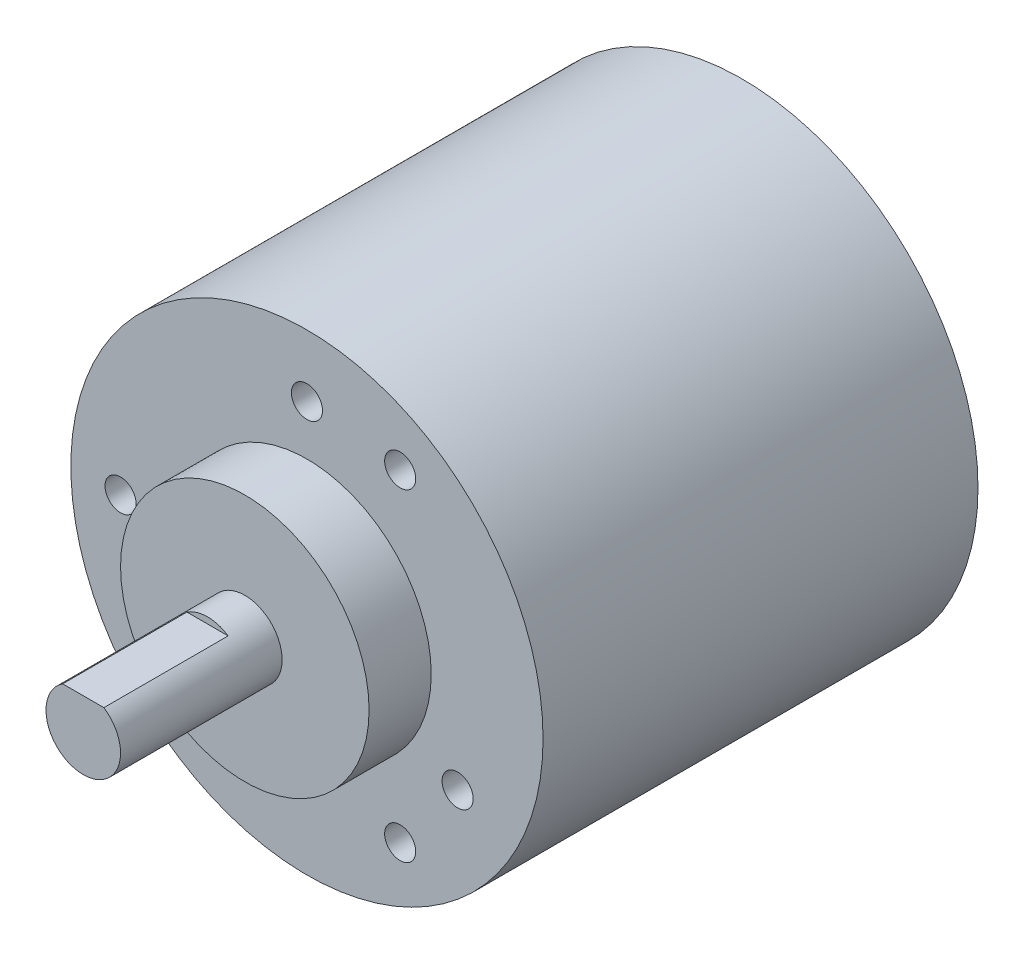
ISO-10303-21;
HEADER;
FILE_DESCRIPTION(('STEP AP214'),'2;1');
FILE_NAME('part.step','',(''),(''),'','','');
FILE_SCHEMA(('AUTOMOTIVE_DESIGN { 1 0 10303 214 1 1 1 1 }'));
ENDSEC;
DATA;
#1=APPLICATION_CONTEXT('core data for automotive mechanical design processes');
#2=APPLICATION_PROTOCOL_DEFINITION('international standard','automotive_design',2000,#1);
#3=PRODUCT_CONTEXT('',#1,'mechanical');
#4=PRODUCT('Part','Part','',(#3));
#5=PRODUCT_RELATED_PRODUCT_CATEGORY('part','',(#4));
#6=PRODUCT_DEFINITION_FORMATION('','',#4);
#7=PRODUCT_DEFINITION_CONTEXT('part definition',#1,'design');
#8=PRODUCT_DEFINITION('design','',#6,#7);
#9=PRODUCT_DEFINITION_SHAPE('','',#8);
#10=(LENGTH_UNIT() NAMED_UNIT(*) SI_UNIT(.MILLI.,.METRE.));
#11=(NAMED_UNIT(*) PLANE_ANGLE_UNIT() SI_UNIT($,.RADIAN.));
#12=(NAMED_UNIT(*) SI_UNIT($,.STERADIAN.) SOLID_ANGLE_UNIT());
#13=UNCERTAINTY_MEASURE_WITH_UNIT(LENGTH_MEASURE(1.E-05),#10,'distance_accuracy_value','');
#14=(GEOMETRIC_REPRESENTATION_CONTEXT(3) GLOBAL_UNCERTAINTY_ASSIGNED_CONTEXT((#13)) GLOBAL_UNIT_ASSIGNED_CONTEXT((#10,
#11,#12)) REPRESENTATION_CONTEXT('',''));
#15=CARTESIAN_POINT('',(0.,0.,0.));
#16=DIRECTION('',(0.,0.,1.));
#17=DIRECTION('',(1.,0.,0.));
#18=AXIS2_PLACEMENT_3D('',#15,#16,#17);
#19=CARTESIAN_POINT('',(0.,0.,35.));
#20=DIRECTION('',(0.,0.,-1.));
#21=DIRECTION('',(-1.,0.,0.));
#22=AXIS2_PLACEMENT_3D('',#19,#20,#21);
#23=CYLINDRICAL_SURFACE('',#22,19.);
#24=CARTESIAN_POINT('',(0.,0.,35.));
#25=DIRECTION('',(0.,0.,1.));
#26=DIRECTION('',(1.,0.,0.));
#27=AXIS2_PLACEMENT_3D('',#24,#25,#26);
#28=CIRCLE('',#27,19.);
#29=CARTESIAN_POINT('',(19.,0.,35.));
#30=VERTEX_POINT('',#29);
#31=EDGE_CURVE('E166',#30,#30,#28,.T.);
#32=ORIENTED_EDGE('',*,*,#31,.F.);
#33=EDGE_LOOP('',(#32));
#34=FACE_BOUND('',#33,.T.);
#35=CARTESIAN_POINT('',(0.,0.,0.));
#36=DIRECTION('',(0.,0.,1.));
#37=DIRECTION('',(1.,0.,0.));
#38=AXIS2_PLACEMENT_3D('',#35,#36,#37);
#39=CIRCLE('',#38,19.);
#40=CARTESIAN_POINT('',(19.,0.,0.));
#41=VERTEX_POINT('',#40);
#42=EDGE_CURVE('E41',#41,#41,#39,.T.);
#43=ORIENTED_EDGE('',*,*,#42,.T.);
#44=EDGE_LOOP('',(#43));
#45=FACE_BOUND('',#44,.T.);
#46=ADVANCED_FACE('F38',(#34,#45),#23,.T.);
#47=CARTESIAN_POINT('',(0.,0.,35.));
#48=DIRECTION('',(0.,0.,1.));
#49=DIRECTION('',(1.,0.,0.));
#50=AXIS2_PLACEMENT_3D('',#47,#48,#49);
#51=PLANE('',#50);
#52=CARTESIAN_POINT('',(0.,14.,35.));
#53=DIRECTION('',(0.,0.,1.));
#54=DIRECTION('',(1.,0.,0.));
#55=AXIS2_PLACEMENT_3D('',#52,#53,#54);
#56=CIRCLE('',#55,1.24999999999999);
#57=CARTESIAN_POINT('',(1.24999999999999,14.,35.));
#58=VERTEX_POINT('',#57);
#59=EDGE_CURVE('E99',#58,#58,#56,.T.);
#60=ORIENTED_EDGE('',*,*,#59,.F.);
#61=EDGE_LOOP('',(#60));
#62=FACE_BOUND('',#61,.T.);
#63=CARTESIAN_POINT('',(7.49999999999992,12.9903810567666,35.));
#64=DIRECTION('',(0.,0.,1.));
#65=DIRECTION('',(1.,0.,0.));
#66=AXIS2_PLACEMENT_3D('',#63,#64,#65);
#67=CIRCLE('',#66,1.24999999999999);
#68=CARTESIAN_POINT('',(8.74999999999991,12.9903810567666,35.));
#69=VERTEX_POINT('',#68);
#70=EDGE_CURVE('E98',#69,#69,#67,.T.);
#71=ORIENTED_EDGE('',*,*,#70,.F.);
#72=EDGE_LOOP('',(#71));
#73=FACE_BOUND('',#72,.T.);
#74=CARTESIAN_POINT('',(12.124355652983,-6.99999999999948,35.));
#75=DIRECTION('',(0.,0.,1.));
#76=DIRECTION('',(1.,0.,0.));
#77=AXIS2_PLACEMENT_3D('',#74,#75,#76);
#78=CIRCLE('',#77,1.24999999999999);
#79=CARTESIAN_POINT('',(13.374355652983,-6.99999999999948,35.));
#80=VERTEX_POINT('',#79);
#81=EDGE_CURVE('E112',#80,#80,#78,.T.);
#82=ORIENTED_EDGE('',*,*,#81,.F.);
#83=EDGE_LOOP('',(#82));
#84=FACE_BOUND('',#83,.T.);
#85=CARTESIAN_POINT('',(7.50000000000097,-12.990381056766,35.));
#86=DIRECTION('',(0.,0.,1.));
#87=DIRECTION('',(1.,0.,0.));
#88=AXIS2_PLACEMENT_3D('',#85,#86,#87);
#89=CIRCLE('',#88,1.24999999999999);
#90=CARTESIAN_POINT('',(8.75000000000096,-12.990381056766,35.));
#91=VERTEX_POINT('',#90);
#92=EDGE_CURVE('E120',#91,#91,#89,.T.);
#93=ORIENTED_EDGE('',*,*,#92,.F.);
#94=EDGE_LOOP('',(#93));
#95=FACE_BOUND('',#94,.T.);
#96=CARTESIAN_POINT('',(-12.1243556529813,-7.00000000000051,35.));
#97=DIRECTION('',(0.,0.,1.));
#98=DIRECTION('',(1.,0.,0.));
#99=AXIS2_PLACEMENT_3D('',#96,#97,#98);
#100=CIRCLE('',#99,1.24999999999999);
#101=CARTESIAN_POINT('',(-10.8743556529813,-7.00000000000051,35.));
#102=VERTEX_POINT('',#101);
#103=EDGE_CURVE('E128',#102,#102,#100,.T.);
#104=ORIENTED_EDGE('',*,*,#103,.F.);
#105=EDGE_LOOP('',(#104));
#106=FACE_BOUND('',#105,.T.);
#107=CARTESIAN_POINT('',(-14.9999999999991,-6.030326565387E-13,35.));
#108=DIRECTION('',(0.,0.,1.));
#109=DIRECTION('',(1.,0.,0.));
#110=AXIS2_PLACEMENT_3D('',#107,#108,#109);
#111=CIRCLE('',#110,1.24999999999999);
#112=CARTESIAN_POINT('',(-13.7499999999991,-6.030326565387E-13,35.));
#113=VERTEX_POINT('',#112);
#114=EDGE_CURVE('E136',#113,#113,#111,.T.);
#115=ORIENTED_EDGE('',*,*,#114,.F.);
#116=EDGE_LOOP('',(#115));
#117=FACE_BOUND('',#116,.T.);
#118=CARTESIAN_POINT('',(0.,0.,35.));
#119=DIRECTION('',(0.,0.,1.));
#120=DIRECTION('',(1.,0.,0.));
#121=AXIS2_PLACEMENT_3D('',#118,#119,#120);
#122=CIRCLE('',#121,10.);
#123=CARTESIAN_POINT('',(10.,0.,35.));
#124=VERTEX_POINT('',#123);
#125=EDGE_CURVE('E47',#124,#124,#122,.T.);
#126=ORIENTED_EDGE('',*,*,#125,.F.);
#127=EDGE_LOOP('',(#126));
#128=FACE_BOUND('',#127,.T.);
#129=ORIENTED_EDGE('',*,*,#31,.T.);
#130=EDGE_LOOP('',(#129));
#131=FACE_BOUND('',#130,.T.);
#132=ADVANCED_FACE('F179',(#62,#73,#84,#95,#106,#117,#128,#131),#51,.T.);
#133=CARTESIAN_POINT('',(0.,0.,0.));
#134=DIRECTION('',(0.,0.,1.));
#135=DIRECTION('',(1.,0.,0.));
#136=AXIS2_PLACEMENT_3D('',#133,#134,#135);
#137=PLANE('',#136);
#138=ORIENTED_EDGE('',*,*,#42,.F.);
#139=EDGE_LOOP('',(#138));
#140=FACE_BOUND('',#139,.T.);
#141=ADVANCED_FACE('F176',(#140),#137,.F.);
#142=CARTESIAN_POINT('',(0.,0.,40.));
#143=DIRECTION('',(0.,0.,-1.));
#144=DIRECTION('',(-1.,0.,0.));
#145=AXIS2_PLACEMENT_3D('',#142,#143,#144);
#146=CYLINDRICAL_SURFACE('',#145,10.);
#147=CARTESIAN_POINT('',(0.,0.,40.));
#148=DIRECTION('',(0.,0.,1.));
#149=DIRECTION('',(1.,0.,0.));
#150=AXIS2_PLACEMENT_3D('',#147,#148,#149);
#151=CIRCLE('',#150,10.);
#152=CARTESIAN_POINT('',(10.,0.,40.));
#153=VERTEX_POINT('',#152);
#154=EDGE_CURVE('E159',#153,#153,#151,.T.);
#155=ORIENTED_EDGE('',*,*,#154,.F.);
#156=EDGE_LOOP('',(#155));
#157=FACE_BOUND('',#156,.T.);
#158=ORIENTED_EDGE('',*,*,#125,.T.);
#159=EDGE_LOOP('',(#158));
#160=FACE_BOUND('',#159,.T.);
#161=ADVANCED_FACE('F178',(#157,#160),#146,.T.);
#162=CARTESIAN_POINT('',(0.,0.,40.));
#163=DIRECTION('',(0.,0.,1.));
#164=DIRECTION('',(1.,0.,0.));
#165=AXIS2_PLACEMENT_3D('',#162,#163,#164);
#166=PLANE('',#165);
#167=CARTESIAN_POINT('',(0.,0.,40.));
#168=DIRECTION('',(0.,0.,1.));
#169=DIRECTION('',(1.,0.,0.));
#170=AXIS2_PLACEMENT_3D('',#167,#168,#169);
#171=CIRCLE('',#170,3.);
#172=CARTESIAN_POINT('',(3.,0.,40.));
#173=VERTEX_POINT('',#172);
#174=EDGE_CURVE('E11',#173,#173,#171,.T.);
#175=ORIENTED_EDGE('',*,*,#174,.F.);
#176=EDGE_LOOP('',(#175));
#177=FACE_BOUND('',#176,.T.);
#178=ORIENTED_EDGE('',*,*,#154,.T.);
#179=EDGE_LOOP('',(#178));
#180=FACE_BOUND('',#179,.T.);
#181=ADVANCED_FACE('F184',(#177,#180),#166,.T.);
#182=CARTESIAN_POINT('',(0.,0.,53.));
#183=DIRECTION('',(0.,0.,-1.));
#184=DIRECTION('',(-1.,0.,0.));
#185=AXIS2_PLACEMENT_3D('',#182,#183,#184);
#186=CYLINDRICAL_SURFACE('',#185,3.);
#187=CARTESIAN_POINT('',(0.,0.,53.));
#188=DIRECTION('',(0.,0.,1.));
#189=DIRECTION('',(1.,0.,0.));
#190=AXIS2_PLACEMENT_3D('',#187,#188,#189);
#191=CIRCLE('',#190,3.);
#192=CARTESIAN_POINT('',(-1.6583123951777,2.5,53.));
#193=VERTEX_POINT('',#192);
#194=CARTESIAN_POINT('',(1.6583123951777,2.5,53.));
#195=VERTEX_POINT('',#194);
#196=EDGE_CURVE('E154',#193,#195,#191,.T.);
#197=ORIENTED_EDGE('',*,*,#196,.F.);
#198=DIRECTION('',(0.,0.,1.));
#199=VECTOR('',#198,1.);
#200=CARTESIAN_POINT('',(-1.6583123951777,2.5,43.));
#201=LINE('',#200,#199);
#202=CARTESIAN_POINT('',(-1.6583123951777,2.5,43.));
#203=VERTEX_POINT('',#202);
#204=EDGE_CURVE('E55',#203,#193,#201,.T.);
#205=ORIENTED_EDGE('',*,*,#204,.F.);
#206=CARTESIAN_POINT('',(0.,0.,43.));
#207=DIRECTION('',(0.,0.,1.));
#208=DIRECTION('',(1.,0.,0.));
#209=AXIS2_PLACEMENT_3D('',#206,#207,#208);
#210=CIRCLE('',#209,3.);
#211=CARTESIAN_POINT('',(1.6583123951777,2.5,43.));
#212=VERTEX_POINT('',#211);
#213=EDGE_CURVE('E144',#212,#203,#210,.T.);
#214=ORIENTED_EDGE('',*,*,#213,.F.);
#215=DIRECTION('',(0.,0.,1.));
#216=VECTOR('',#215,1.);
#217=CARTESIAN_POINT('',(1.6583123951777,2.5,43.));
#218=LINE('',#217,#216);
#219=EDGE_CURVE('E61',#212,#195,#218,.T.);
#220=ORIENTED_EDGE('',*,*,#219,.T.);
#221=EDGE_LOOP('',(#197,#205,#214,#220));
#222=FACE_BOUND('',#221,.T.);
#223=ORIENTED_EDGE('',*,*,#174,.T.);
#224=EDGE_LOOP('',(#223));
#225=FACE_BOUND('',#224,.T.);
#226=ADVANCED_FACE('F330',(#222,#225),#186,.T.);
#227=CARTESIAN_POINT('',(0.,0.,53.));
#228=DIRECTION('',(0.,0.,1.));
#229=DIRECTION('',(1.,0.,0.));
#230=AXIS2_PLACEMENT_3D('',#227,#228,#229);
#231=PLANE('',#230);
#232=DIRECTION('',(1.,0.,0.));
#233=VECTOR('',#232,1.);
#234=CARTESIAN_POINT('',(-1.6583123951777,2.5,53.));
#235=LINE('',#234,#233);
#236=EDGE_CURVE('E68',#193,#195,#235,.T.);
#237=ORIENTED_EDGE('',*,*,#236,.F.);
#238=ORIENTED_EDGE('',*,*,#196,.T.);
#239=EDGE_LOOP('',(#237,#238));
#240=FACE_BOUND('',#239,.T.);
#241=ADVANCED_FACE('F327',(#240),#231,.T.);
#242=CARTESIAN_POINT('',(-1.6583123951777,2.5,43.));
#243=DIRECTION('',(0.,-1.,0.));
#244=DIRECTION('',(0.,0.,-1.));
#245=AXIS2_PLACEMENT_3D('',#242,#243,#244);
#246=PLANE('',#245);
#247=ORIENTED_EDGE('',*,*,#236,.T.);
#248=ORIENTED_EDGE('',*,*,#219,.F.);
#249=DIRECTION('',(1.,0.,0.));
#250=VECTOR('',#249,1.);
#251=CARTESIAN_POINT('',(-1.6583123951777,2.5,43.));
#252=LINE('',#251,#250);
#253=EDGE_CURVE('E147',#203,#212,#252,.T.);
#254=ORIENTED_EDGE('',*,*,#253,.F.);
#255=ORIENTED_EDGE('',*,*,#204,.T.);
#256=EDGE_LOOP('',(#247,#248,#254,#255));
#257=FACE_BOUND('',#256,.T.);
#258=ADVANCED_FACE('F323',(#257),#246,.F.);
#259=CARTESIAN_POINT('',(0.,0.,43.));
#260=DIRECTION('',(0.,0.,1.));
#261=DIRECTION('',(1.,0.,0.));
#262=AXIS2_PLACEMENT_3D('',#259,#260,#261);
#263=PLANE('',#262);
#264=ORIENTED_EDGE('',*,*,#213,.T.);
#265=ORIENTED_EDGE('',*,*,#253,.T.);
#266=EDGE_LOOP('',(#264,#265));
#267=FACE_BOUND('',#266,.T.);
#268=ADVANCED_FACE('F204',(#267),#263,.T.);
#269=CARTESIAN_POINT('',(-14.9999999999991,-6.030326565387E-13,30.));
#270=DIRECTION('',(0.,0.,1.));
#271=DIRECTION('',(1.,0.,0.));
#272=AXIS2_PLACEMENT_3D('',#269,#270,#271);
#273=CONICAL_SURFACE('',#272,1.25,1.02974425867665);
#274=CARTESIAN_POINT('',(-14.9999999999991,-6.030326565387E-13,29.2489242262156));
#275=VERTEX_POINT('',#274);
#276=VERTEX_LOOP('',#275);
#277=FACE_BOUND('',#276,.T.);
#278=CARTESIAN_POINT('',(-14.9999999999991,-6.030326565387E-13,30.));
#279=DIRECTION('',(0.,0.,1.));
#280=DIRECTION('',(1.,0.,0.));
#281=AXIS2_PLACEMENT_3D('',#278,#279,#280);
#282=CIRCLE('',#281,1.25);
#283=CARTESIAN_POINT('',(-13.7499999999991,-6.030326565387E-13,30.));
#284=VERTEX_POINT('',#283);
#285=EDGE_CURVE('E140',#284,#284,#282,.T.);
#286=ORIENTED_EDGE('',*,*,#285,.T.);
#287=EDGE_LOOP('',(#286));
#288=FACE_BOUND('',#287,.T.);
#289=ADVANCED_FACE('F209',(#277,#288),#273,.F.);
#290=CARTESIAN_POINT('',(-14.9999999999991,-6.030326565387E-13,35.));
#291=DIRECTION('',(0.,0.,1.));
#292=DIRECTION('',(1.,0.,0.));
#293=AXIS2_PLACEMENT_3D('',#290,#291,#292);
#294=CYLINDRICAL_SURFACE('',#293,1.24999999999999);
#295=ORIENTED_EDGE('',*,*,#285,.F.);
#296=EDGE_LOOP('',(#295));
#297=FACE_BOUND('',#296,.T.);
#298=ORIENTED_EDGE('',*,*,#114,.T.);
#299=EDGE_LOOP('',(#298));
#300=FACE_BOUND('',#299,.T.);
#301=ADVANCED_FACE('F214',(#297,#300),#294,.F.);
#302=CARTESIAN_POINT('',(-12.1243556529813,-7.00000000000051,30.));
#303=DIRECTION('',(0.,0.,1.));
#304=DIRECTION('',(1.,0.,0.));
#305=AXIS2_PLACEMENT_3D('',#302,#303,#304);
#306=CONICAL_SURFACE('',#305,1.25,1.02974425867665);
#307=CARTESIAN_POINT('',(-12.1243556529813,-7.00000000000051,29.2489242262156));
#308=VERTEX_POINT('',#307);
#309=VERTEX_LOOP('',#308);
#310=FACE_BOUND('',#309,.T.);
#311=CARTESIAN_POINT('',(-12.1243556529813,-7.00000000000051,30.));
#312=DIRECTION('',(0.,0.,1.));
#313=DIRECTION('',(1.,0.,0.));
#314=AXIS2_PLACEMENT_3D('',#311,#312,#313);
#315=CIRCLE('',#314,1.25);
#316=CARTESIAN_POINT('',(-10.8743556529813,-7.00000000000051,30.));
#317=VERTEX_POINT('',#316);
#318=EDGE_CURVE('E132',#317,#317,#315,.T.);
#319=ORIENTED_EDGE('',*,*,#318,.T.);
#320=EDGE_LOOP('',(#319));
#321=FACE_BOUND('',#320,.T.);
#322=ADVANCED_FACE('F223',(#310,#321),#306,.F.);
#323=CARTESIAN_POINT('',(-12.1243556529813,-7.00000000000051,35.));
#324=DIRECTION('',(0.,0.,1.));
#325=DIRECTION('',(1.,0.,0.));
#326=AXIS2_PLACEMENT_3D('',#323,#324,#325);
#327=CYLINDRICAL_SURFACE('',#326,1.24999999999999);
#328=ORIENTED_EDGE('',*,*,#318,.F.);
#329=EDGE_LOOP('',(#328));
#330=FACE_BOUND('',#329,.T.);
#331=ORIENTED_EDGE('',*,*,#103,.T.);
#332=EDGE_LOOP('',(#331));
#333=FACE_BOUND('',#332,.T.);
#334=ADVANCED_FACE('F233',(#330,#333),#327,.F.);
#335=CARTESIAN_POINT('',(7.50000000000097,-12.990381056766,30.));
#336=DIRECTION('',(0.,0.,1.));
#337=DIRECTION('',(1.,0.,0.));
#338=AXIS2_PLACEMENT_3D('',#335,#336,#337);
#339=CONICAL_SURFACE('',#338,1.25,1.02974425867665);
#340=CARTESIAN_POINT('',(7.50000000000097,-12.990381056766,29.2489242262156));
#341=VERTEX_POINT('',#340);
#342=VERTEX_LOOP('',#341);
#343=FACE_BOUND('',#342,.T.);
#344=CARTESIAN_POINT('',(7.50000000000097,-12.990381056766,30.));
#345=DIRECTION('',(0.,0.,1.));
#346=DIRECTION('',(1.,0.,0.));
#347=AXIS2_PLACEMENT_3D('',#344,#345,#346);
#348=CIRCLE('',#347,1.25);
#349=CARTESIAN_POINT('',(8.75000000000097,-12.990381056766,30.));
#350=VERTEX_POINT('',#349);
#351=EDGE_CURVE('E124',#350,#350,#348,.T.);
#352=ORIENTED_EDGE('',*,*,#351,.T.);
#353=EDGE_LOOP('',(#352));
#354=FACE_BOUND('',#353,.T.);
#355=ADVANCED_FACE('F243',(#343,#354),#339,.F.);
#356=CARTESIAN_POINT('',(7.50000000000097,-12.990381056766,35.));
#357=DIRECTION('',(0.,0.,1.));
#358=DIRECTION('',(1.,0.,0.));
#359=AXIS2_PLACEMENT_3D('',#356,#357,#358);
#360=CYLINDRICAL_SURFACE('',#359,1.24999999999999);
#361=ORIENTED_EDGE('',*,*,#351,.F.);
#362=EDGE_LOOP('',(#361));
#363=FACE_BOUND('',#362,.T.);
#364=ORIENTED_EDGE('',*,*,#92,.T.);
#365=EDGE_LOOP('',(#364));
#366=FACE_BOUND('',#365,.T.);
#367=ADVANCED_FACE('F253',(#363,#366),#360,.F.);
#368=CARTESIAN_POINT('',(12.124355652983,-6.99999999999948,30.));
#369=DIRECTION('',(0.,0.,1.));
#370=DIRECTION('',(1.,0.,0.));
#371=AXIS2_PLACEMENT_3D('',#368,#369,#370);
#372=CONICAL_SURFACE('',#371,1.25,1.02974425867665);
#373=CARTESIAN_POINT('',(12.124355652983,-6.99999999999948,29.2489242262156));
#374=VERTEX_POINT('',#373);
#375=VERTEX_LOOP('',#374);
#376=FACE_BOUND('',#375,.T.);
#377=CARTESIAN_POINT('',(12.124355652983,-6.99999999999948,30.));
#378=DIRECTION('',(0.,0.,1.));
#379=DIRECTION('',(1.,0.,0.));
#380=AXIS2_PLACEMENT_3D('',#377,#378,#379);
#381=CIRCLE('',#380,1.25);
#382=CARTESIAN_POINT('',(13.374355652983,-6.99999999999948,30.));
#383=VERTEX_POINT('',#382);
#384=EDGE_CURVE('E116',#383,#383,#381,.T.);
#385=ORIENTED_EDGE('',*,*,#384,.T.);
#386=EDGE_LOOP('',(#385));
#387=FACE_BOUND('',#386,.T.);
#388=ADVANCED_FACE('F263',(#376,#387),#372,.F.);
#389=CARTESIAN_POINT('',(12.124355652983,-6.99999999999948,35.));
#390=DIRECTION('',(0.,0.,1.));
#391=DIRECTION('',(1.,0.,0.));
#392=AXIS2_PLACEMENT_3D('',#389,#390,#391);
#393=CYLINDRICAL_SURFACE('',#392,1.24999999999999);
#394=ORIENTED_EDGE('',*,*,#384,.F.);
#395=EDGE_LOOP('',(#394));
#396=FACE_BOUND('',#395,.T.);
#397=ORIENTED_EDGE('',*,*,#81,.T.);
#398=EDGE_LOOP('',(#397));
#399=FACE_BOUND('',#398,.T.);
#400=ADVANCED_FACE('F273',(#396,#399),#393,.F.);
#401=CARTESIAN_POINT('',(7.49999999999992,12.9903810567666,30.));
#402=DIRECTION('',(0.,0.,1.));
#403=DIRECTION('',(1.,0.,0.));
#404=AXIS2_PLACEMENT_3D('',#401,#402,#403);
#405=CONICAL_SURFACE('',#404,1.25,1.02974425867665);
#406=CARTESIAN_POINT('',(7.49999999999992,12.9903810567666,29.2489242262156));
#407=VERTEX_POINT('',#406);
#408=VERTEX_LOOP('',#407);
#409=FACE_BOUND('',#408,.T.);
#410=CARTESIAN_POINT('',(7.49999999999992,12.9903810567666,30.));
#411=DIRECTION('',(0.,0.,1.));
#412=DIRECTION('',(1.,0.,0.));
#413=AXIS2_PLACEMENT_3D('',#410,#411,#412);
#414=CIRCLE('',#413,1.25);
#415=CARTESIAN_POINT('',(8.74999999999992,12.9903810567666,30.));
#416=VERTEX_POINT('',#415);
#417=EDGE_CURVE('E104',#416,#416,#414,.T.);
#418=ORIENTED_EDGE('',*,*,#417,.T.);
#419=EDGE_LOOP('',(#418));
#420=FACE_BOUND('',#419,.T.);
#421=ADVANCED_FACE('F283',(#409,#420),#405,.F.);
#422=CARTESIAN_POINT('',(7.49999999999992,12.9903810567666,35.));
#423=DIRECTION('',(0.,0.,1.));
#424=DIRECTION('',(1.,0.,0.));
#425=AXIS2_PLACEMENT_3D('',#422,#423,#424);
#426=CYLINDRICAL_SURFACE('',#425,1.24999999999999);
#427=ORIENTED_EDGE('',*,*,#417,.F.);
#428=EDGE_LOOP('',(#427));
#429=FACE_BOUND('',#428,.T.);
#430=ORIENTED_EDGE('',*,*,#70,.T.);
#431=EDGE_LOOP('',(#430));
#432=FACE_BOUND('',#431,.T.);
#433=ADVANCED_FACE('F91',(#429,#432),#426,.F.);
#434=CARTESIAN_POINT('',(0.,14.,30.));
#435=DIRECTION('',(0.,0.,1.));
#436=DIRECTION('',(1.,0.,0.));
#437=AXIS2_PLACEMENT_3D('',#434,#435,#436);
#438=CONICAL_SURFACE('',#437,1.25,1.02974425867665);
#439=CARTESIAN_POINT('',(0.,14.,29.2489242262156));
#440=VERTEX_POINT('',#439);
#441=VERTEX_LOOP('',#440);
#442=FACE_BOUND('',#441,.T.);
#443=CARTESIAN_POINT('',(0.,14.,30.));
#444=DIRECTION('',(0.,0.,1.));
#445=DIRECTION('',(1.,0.,0.));
#446=AXIS2_PLACEMENT_3D('',#443,#444,#445);
#447=CIRCLE('',#446,1.25);
#448=CARTESIAN_POINT('',(1.25,14.,30.));
#449=VERTEX_POINT('',#448);
#450=EDGE_CURVE('E95',#449,#449,#447,.T.);
#451=ORIENTED_EDGE('',*,*,#450,.T.);
#452=EDGE_LOOP('',(#451));
#453=FACE_BOUND('',#452,.T.);
#454=ADVANCED_FACE('F87',(#442,#453),#438,.F.);
#455=CARTESIAN_POINT('',(0.,14.,35.));
#456=DIRECTION('',(0.,0.,1.));
#457=DIRECTION('',(1.,0.,0.));
#458=AXIS2_PLACEMENT_3D('',#455,#456,#457);
#459=CYLINDRICAL_SURFACE('',#458,1.24999999999999);
#460=ORIENTED_EDGE('',*,*,#450,.F.);
#461=EDGE_LOOP('',(#460));
#462=FACE_BOUND('',#461,.T.);
#463=ORIENTED_EDGE('',*,*,#59,.T.);
#464=EDGE_LOOP('',(#463));
#465=FACE_BOUND('',#464,.T.);
#466=ADVANCED_FACE('F90',(#462,#465),#459,.F.);
#467=CLOSED_SHELL('',(#46,#132,#141,#161,#181,#226,#241,#258,#268,#289,#301,#322,#334,#355,#367,
#388,#400,#421,#433,#454,#466));
#468=MANIFOLD_SOLID_BREP('B2',#467);
#469=ADVANCED_BREP_SHAPE_REPRESENTATION('',(#18,#468),#14);
#470=SHAPE_DEFINITION_REPRESENTATION(#9,#469);
ENDSEC;
END-ISO-10303-21;
